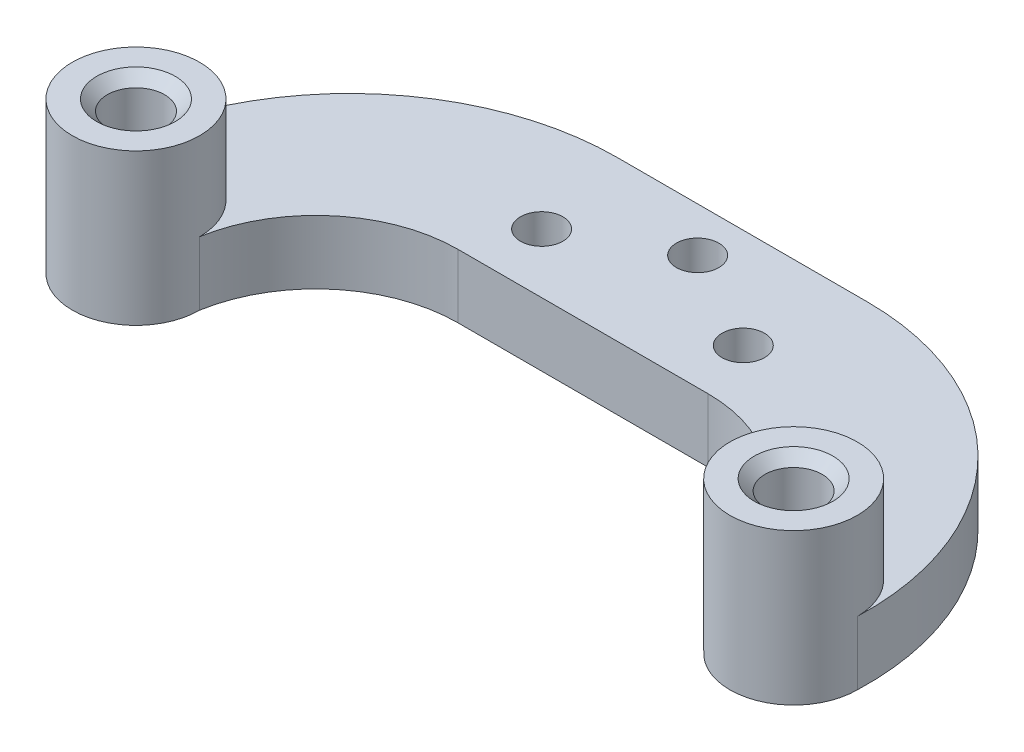
ISO-10303-21;
HEADER;
FILE_DESCRIPTION(('STEP AP214'),'2;1');
FILE_NAME('part.step','',(''),(''),'','','');
FILE_SCHEMA(('AUTOMOTIVE_DESIGN { 1 0 10303 214 1 1 1 1 }'));
ENDSEC;
DATA;
#1=APPLICATION_CONTEXT('core data for automotive mechanical design processes');
#2=APPLICATION_PROTOCOL_DEFINITION('international standard','automotive_design',2000,#1);
#3=PRODUCT_CONTEXT('',#1,'mechanical');
#4=PRODUCT('Part','Part','',(#3));
#5=PRODUCT_RELATED_PRODUCT_CATEGORY('part','',(#4));
#6=PRODUCT_DEFINITION_FORMATION('','',#4);
#7=PRODUCT_DEFINITION_CONTEXT('part definition',#1,'design');
#8=PRODUCT_DEFINITION('design','',#6,#7);
#9=PRODUCT_DEFINITION_SHAPE('','',#8);
#10=(LENGTH_UNIT() NAMED_UNIT(*) SI_UNIT(.MILLI.,.METRE.));
#11=(NAMED_UNIT(*) PLANE_ANGLE_UNIT() SI_UNIT($,.RADIAN.));
#12=(NAMED_UNIT(*) SI_UNIT($,.STERADIAN.) SOLID_ANGLE_UNIT());
#13=UNCERTAINTY_MEASURE_WITH_UNIT(LENGTH_MEASURE(1.E-05),#10,'distance_accuracy_value','');
#14=(GEOMETRIC_REPRESENTATION_CONTEXT(3) GLOBAL_UNCERTAINTY_ASSIGNED_CONTEXT((#13)) GLOBAL_UNIT_ASSIGNED_CONTEXT((#10,
#11,#12)) REPRESENTATION_CONTEXT('',''));
#15=CARTESIAN_POINT('',(0.,0.,0.));
#16=DIRECTION('',(0.,0.,1.));
#17=DIRECTION('',(1.,0.,0.));
#18=AXIS2_PLACEMENT_3D('',#15,#16,#17);
#19=CARTESIAN_POINT('',(5.88625351409411,3.,12.6147601845515));
#20=DIRECTION('',(0.,-1.,0.));
#21=DIRECTION('',(0.,0.,-1.));
#22=AXIS2_PLACEMENT_3D('',#19,#20,#21);
#23=CYLINDRICAL_SURFACE('',#22,12.6147601845515);
#24=CARTESIAN_POINT('',(5.88625351409411,0.,12.6147601845515));
#25=DIRECTION('',(0.,1.,0.));
#26=DIRECTION('',(0.,0.,1.));
#27=AXIS2_PLACEMENT_3D('',#24,#25,#26);
#28=CIRCLE('',#27,12.6147601845515);
#29=CARTESIAN_POINT('',(5.88625351409411,0.,0.));
#30=VERTEX_POINT('',#29);
#31=CARTESIAN_POINT('',(18.492796705,0.,13.07));
#32=VERTEX_POINT('',#31);
#33=EDGE_CURVE('E148',#30,#32,#28,.F.);
#34=ORIENTED_EDGE('',*,*,#33,.F.);
#35=DIRECTION('',(0.,-1.,0.));
#36=VECTOR('',#35,1.);
#37=CARTESIAN_POINT('',(5.88625351409411,3.,0.));
#38=LINE('',#37,#36);
#39=CARTESIAN_POINT('',(5.88625351409411,3.,0.));
#40=VERTEX_POINT('',#39);
#41=EDGE_CURVE('E97',#40,#30,#38,.T.);
#42=ORIENTED_EDGE('',*,*,#41,.F.);
#43=CARTESIAN_POINT('',(5.88625351409411,3.,12.6147601845515));
#44=DIRECTION('',(0.,1.,0.));
#45=DIRECTION('',(0.,0.,1.));
#46=AXIS2_PLACEMENT_3D('',#43,#44,#45);
#47=CIRCLE('',#46,12.6147601845515);
#48=CARTESIAN_POINT('',(18.492796705,3.,13.07));
#49=VERTEX_POINT('',#48);
#50=EDGE_CURVE('E181',#40,#49,#47,.F.);
#51=ORIENTED_EDGE('',*,*,#50,.T.);
#52=DIRECTION('',(0.,-1.,0.));
#53=VECTOR('',#52,1.);
#54=CARTESIAN_POINT('',(18.492796705,3.,13.07));
#55=LINE('',#54,#53);
#56=EDGE_CURVE('E92',#49,#32,#55,.T.);
#57=ORIENTED_EDGE('',*,*,#56,.T.);
#58=EDGE_LOOP('',(#34,#42,#51,#57));
#59=FACE_BOUND('',#58,.T.);
#60=ADVANCED_FACE('F38',(#59),#23,.T.);
#61=CARTESIAN_POINT('',(0.,3.,0.));
#62=DIRECTION('',(0.,0.,-1.));
#63=DIRECTION('',(-1.,0.,0.));
#64=AXIS2_PLACEMENT_3D('',#61,#62,#63);
#65=PLANE('',#64);
#66=DIRECTION('',(1.,0.,0.));
#67=VECTOR('',#66,1.);
#68=CARTESIAN_POINT('',(0.,0.,0.));
#69=LINE('',#68,#67);
#70=CARTESIAN_POINT('',(-5.88625351409411,0.,0.));
#71=VERTEX_POINT('',#70);
#72=EDGE_CURVE('E151',#71,#30,#69,.T.);
#73=ORIENTED_EDGE('',*,*,#72,.F.);
#74=DIRECTION('',(0.,-1.,0.));
#75=VECTOR('',#74,1.);
#76=CARTESIAN_POINT('',(-5.88625351409411,3.,0.));
#77=LINE('',#76,#75);
#78=CARTESIAN_POINT('',(-5.88625351409411,3.,0.));
#79=VERTEX_POINT('',#78);
#80=EDGE_CURVE('E190',#79,#71,#77,.T.);
#81=ORIENTED_EDGE('',*,*,#80,.F.);
#82=DIRECTION('',(1.,0.,0.));
#83=VECTOR('',#82,1.);
#84=CARTESIAN_POINT('',(0.,3.,0.));
#85=LINE('',#84,#83);
#86=EDGE_CURVE('E134',#79,#40,#85,.T.);
#87=ORIENTED_EDGE('',*,*,#86,.T.);
#88=ORIENTED_EDGE('',*,*,#41,.T.);
#89=EDGE_LOOP('',(#73,#81,#87,#88));
#90=FACE_BOUND('',#89,.T.);
#91=ADVANCED_FACE('F213',(#90),#65,.T.);
#92=CARTESIAN_POINT('',(-5.88625351409411,3.,12.6147601845515));
#93=DIRECTION('',(0.,-1.,0.));
#94=DIRECTION('',(0.,0.,-1.));
#95=AXIS2_PLACEMENT_3D('',#92,#93,#94);
#96=CYLINDRICAL_SURFACE('',#95,12.6147601845515);
#97=CARTESIAN_POINT('',(-5.88625351409411,0.,12.6147601845515));
#98=DIRECTION('',(0.,1.,0.));
#99=DIRECTION('',(0.,0.,1.));
#100=AXIS2_PLACEMENT_3D('',#97,#98,#99);
#101=CIRCLE('',#100,12.6147601845515);
#102=CARTESIAN_POINT('',(-18.492796705,0.,13.0700000000001));
#103=VERTEX_POINT('',#102);
#104=EDGE_CURVE('E155',#71,#103,#101,.T.);
#105=ORIENTED_EDGE('',*,*,#104,.T.);
#106=DIRECTION('',(0.,-1.,0.));
#107=VECTOR('',#106,1.);
#108=CARTESIAN_POINT('',(-18.492796705,3.,13.0700000000001));
#109=LINE('',#108,#107);
#110=CARTESIAN_POINT('',(-18.492796705,3.,13.0700000000001));
#111=VERTEX_POINT('',#110);
#112=EDGE_CURVE('E187',#111,#103,#109,.T.);
#113=ORIENTED_EDGE('',*,*,#112,.F.);
#114=CARTESIAN_POINT('',(-5.88625351409411,3.,12.6147601845515));
#115=DIRECTION('',(0.,1.,0.));
#116=DIRECTION('',(0.,0.,1.));
#117=AXIS2_PLACEMENT_3D('',#114,#115,#116);
#118=CIRCLE('',#117,12.6147601845515);
#119=EDGE_CURVE('E132',#79,#111,#118,.T.);
#120=ORIENTED_EDGE('',*,*,#119,.F.);
#121=ORIENTED_EDGE('',*,*,#80,.T.);
#122=EDGE_LOOP('',(#105,#113,#120,#121));
#123=FACE_BOUND('',#122,.T.);
#124=ADVANCED_FACE('F218',(#123),#96,.T.);
#125=CARTESIAN_POINT('',(-15.492796705,3.,13.07));
#126=DIRECTION('',(0.,-1.,0.));
#127=DIRECTION('',(0.,0.,-1.));
#128=AXIS2_PLACEMENT_3D('',#125,#126,#127);
#129=CYLINDRICAL_SURFACE('',#128,3.);
#130=CARTESIAN_POINT('',(-15.492796705,0.,13.07));
#131=DIRECTION('',(0.,1.,0.));
#132=DIRECTION('',(0.,0.,1.));
#133=AXIS2_PLACEMENT_3D('',#130,#131,#132);
#134=CIRCLE('',#133,3.);
#135=CARTESIAN_POINT('',(-12.492796705,0.,13.07));
#136=VERTEX_POINT('',#135);
#137=EDGE_CURVE('E157',#103,#136,#134,.T.);
#138=ORIENTED_EDGE('',*,*,#137,.T.);
#139=DIRECTION('',(0.,-1.,0.));
#140=VECTOR('',#139,1.);
#141=CARTESIAN_POINT('',(-12.492796705,3.,13.07));
#142=LINE('',#141,#140);
#143=CARTESIAN_POINT('',(-12.492796705,3.,13.07));
#144=VERTEX_POINT('',#143);
#145=EDGE_CURVE('E120',#144,#136,#142,.T.);
#146=ORIENTED_EDGE('',*,*,#145,.F.);
#147=CARTESIAN_POINT('',(-15.492796705,3.,13.07));
#148=DIRECTION('',(0.,1.,0.));
#149=DIRECTION('',(0.,0.,1.));
#150=AXIS2_PLACEMENT_3D('',#147,#148,#149);
#151=CIRCLE('',#150,2.99999999999999);
#152=EDGE_CURVE('E131',#144,#111,#151,.T.);
#153=ORIENTED_EDGE('',*,*,#152,.T.);
#154=ORIENTED_EDGE('',*,*,#112,.T.);
#155=EDGE_LOOP('',(#138,#146,#153,#154));
#156=FACE_BOUND('',#155,.T.);
#157=CARTESIAN_POINT('',(-15.492796705,7.12,13.07));
#158=DIRECTION('',(0.,1.,0.));
#159=DIRECTION('',(0.,0.,1.));
#160=AXIS2_PLACEMENT_3D('',#157,#158,#159);
#161=CIRCLE('',#160,2.99999999999999);
#162=CARTESIAN_POINT('',(-15.492796705,7.12,16.07));
#163=VERTEX_POINT('',#162);
#164=EDGE_CURVE('E152',#163,#163,#161,.T.);
#165=ORIENTED_EDGE('',*,*,#164,.F.);
#166=EDGE_LOOP('',(#165));
#167=FACE_BOUND('',#166,.T.);
#168=ADVANCED_FACE('F277',(#156,#167),#129,.T.);
#169=CARTESIAN_POINT('',(-5.88625351409411,3.,14.2029903889861));
#170=DIRECTION('',(0.,-1.,0.));
#171=DIRECTION('',(0.,0.,-1.));
#172=AXIS2_PLACEMENT_3D('',#169,#170,#171);
#173=CYLINDRICAL_SURFACE('',#172,6.70299038898609);
#174=CARTESIAN_POINT('',(-5.88625351409411,0.,14.2029903889861));
#175=DIRECTION('',(0.,1.,0.));
#176=DIRECTION('',(0.,0.,1.));
#177=AXIS2_PLACEMENT_3D('',#174,#175,#176);
#178=CIRCLE('',#177,6.70299038898609);
#179=CARTESIAN_POINT('',(-5.88625351409411,0.,7.5));
#180=VERTEX_POINT('',#179);
#181=EDGE_CURVE('E117',#180,#136,#178,.T.);
#182=ORIENTED_EDGE('',*,*,#181,.F.);
#183=DIRECTION('',(0.,-1.,0.));
#184=VECTOR('',#183,1.);
#185=CARTESIAN_POINT('',(-5.88625351409411,3.,7.5));
#186=LINE('',#185,#184);
#187=CARTESIAN_POINT('',(-5.88625351409411,3.,7.5));
#188=VERTEX_POINT('',#187);
#189=EDGE_CURVE('E110',#188,#180,#186,.T.);
#190=ORIENTED_EDGE('',*,*,#189,.F.);
#191=CARTESIAN_POINT('',(-5.88625351409411,3.,14.2029903889861));
#192=DIRECTION('',(0.,1.,0.));
#193=DIRECTION('',(0.,0.,1.));
#194=AXIS2_PLACEMENT_3D('',#191,#192,#193);
#195=CIRCLE('',#194,6.70299038898609);
#196=EDGE_CURVE('E114',#188,#144,#195,.T.);
#197=ORIENTED_EDGE('',*,*,#196,.T.);
#198=ORIENTED_EDGE('',*,*,#145,.T.);
#199=EDGE_LOOP('',(#182,#190,#197,#198));
#200=FACE_BOUND('',#199,.T.);
#201=ADVANCED_FACE('F112',(#200),#173,.F.);
#202=CARTESIAN_POINT('',(0.,3.,7.5));
#203=DIRECTION('',(0.,0.,-1.));
#204=DIRECTION('',(-1.,0.,0.));
#205=AXIS2_PLACEMENT_3D('',#202,#203,#204);
#206=PLANE('',#205);
#207=DIRECTION('',(1.,0.,0.));
#208=VECTOR('',#207,1.);
#209=CARTESIAN_POINT('',(0.,0.,7.5));
#210=LINE('',#209,#208);
#211=CARTESIAN_POINT('',(5.88625351409411,0.,7.5));
#212=VERTEX_POINT('',#211);
#213=EDGE_CURVE('E161',#180,#212,#210,.T.);
#214=ORIENTED_EDGE('',*,*,#213,.T.);
#215=DIRECTION('',(0.,-1.,0.));
#216=VECTOR('',#215,1.);
#217=CARTESIAN_POINT('',(5.88625351409411,3.,7.5));
#218=LINE('',#217,#216);
#219=CARTESIAN_POINT('',(5.88625351409411,3.,7.5));
#220=VERTEX_POINT('',#219);
#221=EDGE_CURVE('E121',#220,#212,#218,.T.);
#222=ORIENTED_EDGE('',*,*,#221,.F.);
#223=DIRECTION('',(1.,0.,0.));
#224=VECTOR('',#223,1.);
#225=CARTESIAN_POINT('',(0.,3.,7.5));
#226=LINE('',#225,#224);
#227=EDGE_CURVE('E124',#188,#220,#226,.T.);
#228=ORIENTED_EDGE('',*,*,#227,.F.);
#229=ORIENTED_EDGE('',*,*,#189,.T.);
#230=EDGE_LOOP('',(#214,#222,#228,#229));
#231=FACE_BOUND('',#230,.T.);
#232=ADVANCED_FACE('F125',(#231),#206,.F.);
#233=CARTESIAN_POINT('',(5.88625351409411,3.,14.2029903889861));
#234=DIRECTION('',(0.,-1.,0.));
#235=DIRECTION('',(0.,0.,-1.));
#236=AXIS2_PLACEMENT_3D('',#233,#234,#235);
#237=CYLINDRICAL_SURFACE('',#236,6.70299038898608);
#238=CARTESIAN_POINT('',(5.88625351409411,0.,14.2029903889861));
#239=DIRECTION('',(0.,1.,0.));
#240=DIRECTION('',(0.,0.,1.));
#241=AXIS2_PLACEMENT_3D('',#238,#239,#240);
#242=CIRCLE('',#241,6.70299038898608);
#243=CARTESIAN_POINT('',(12.492796705,0.,13.07));
#244=VERTEX_POINT('',#243);
#245=EDGE_CURVE('E84',#212,#244,#242,.F.);
#246=ORIENTED_EDGE('',*,*,#245,.T.);
#247=DIRECTION('',(0.,-1.,0.));
#248=VECTOR('',#247,1.);
#249=CARTESIAN_POINT('',(12.492796705,3.,13.07));
#250=LINE('',#249,#248);
#251=CARTESIAN_POINT('',(12.492796705,3.,13.07));
#252=VERTEX_POINT('',#251);
#253=EDGE_CURVE('E183',#252,#244,#250,.T.);
#254=ORIENTED_EDGE('',*,*,#253,.F.);
#255=CARTESIAN_POINT('',(5.88625351409411,3.,14.2029903889861));
#256=DIRECTION('',(0.,1.,0.));
#257=DIRECTION('',(0.,0.,1.));
#258=AXIS2_PLACEMENT_3D('',#255,#256,#257);
#259=CIRCLE('',#258,6.70299038898608);
#260=EDGE_CURVE('E55',#220,#252,#259,.F.);
#261=ORIENTED_EDGE('',*,*,#260,.F.);
#262=ORIENTED_EDGE('',*,*,#221,.T.);
#263=EDGE_LOOP('',(#246,#254,#261,#262));
#264=FACE_BOUND('',#263,.T.);
#265=ADVANCED_FACE('F255',(#264),#237,.F.);
#266=CARTESIAN_POINT('',(-4.75,3.,4.7));
#267=DIRECTION('',(0.,-1.,0.));
#268=DIRECTION('',(0.,0.,-1.));
#269=AXIS2_PLACEMENT_3D('',#266,#267,#268);
#270=CYLINDRICAL_SURFACE('',#269,1.);
#271=CARTESIAN_POINT('',(-4.75,3.,4.7));
#272=DIRECTION('',(0.,1.,0.));
#273=DIRECTION('',(0.,0.,1.));
#274=AXIS2_PLACEMENT_3D('',#271,#272,#273);
#275=CIRCLE('',#274,1.);
#276=CARTESIAN_POINT('',(-4.75,3.,5.7));
#277=VERTEX_POINT('',#276);
#278=EDGE_CURVE('E145',#277,#277,#275,.T.);
#279=ORIENTED_EDGE('',*,*,#278,.T.);
#280=EDGE_LOOP('',(#279));
#281=FACE_BOUND('',#280,.T.);
#282=CARTESIAN_POINT('',(-4.75,0.,4.7));
#283=DIRECTION('',(0.,1.,0.));
#284=DIRECTION('',(0.,0.,1.));
#285=AXIS2_PLACEMENT_3D('',#282,#283,#284);
#286=CIRCLE('',#285,1.);
#287=CARTESIAN_POINT('',(-4.75,0.,5.7));
#288=VERTEX_POINT('',#287);
#289=EDGE_CURVE('E175',#288,#288,#286,.T.);
#290=ORIENTED_EDGE('',*,*,#289,.F.);
#291=EDGE_LOOP('',(#290));
#292=FACE_BOUND('',#291,.T.);
#293=ADVANCED_FACE('F251',(#281,#292),#270,.F.);
#294=CARTESIAN_POINT('',(4.75,3.,4.7));
#295=DIRECTION('',(0.,-1.,0.));
#296=DIRECTION('',(0.,0.,-1.));
#297=AXIS2_PLACEMENT_3D('',#294,#295,#296);
#298=CYLINDRICAL_SURFACE('',#297,1.);
#299=CARTESIAN_POINT('',(4.75,3.,4.7));
#300=DIRECTION('',(0.,1.,0.));
#301=DIRECTION('',(0.,0.,1.));
#302=AXIS2_PLACEMENT_3D('',#299,#300,#301);
#303=CIRCLE('',#302,1.);
#304=CARTESIAN_POINT('',(4.75,3.,5.7));
#305=VERTEX_POINT('',#304);
#306=EDGE_CURVE('E142',#305,#305,#303,.T.);
#307=ORIENTED_EDGE('',*,*,#306,.T.);
#308=EDGE_LOOP('',(#307));
#309=FACE_BOUND('',#308,.T.);
#310=CARTESIAN_POINT('',(4.75,0.,4.7));
#311=DIRECTION('',(0.,1.,0.));
#312=DIRECTION('',(0.,0.,1.));
#313=AXIS2_PLACEMENT_3D('',#310,#311,#312);
#314=CIRCLE('',#313,1.);
#315=CARTESIAN_POINT('',(4.75,0.,5.7));
#316=VERTEX_POINT('',#315);
#317=EDGE_CURVE('E172',#316,#316,#314,.T.);
#318=ORIENTED_EDGE('',*,*,#317,.F.);
#319=EDGE_LOOP('',(#318));
#320=FACE_BOUND('',#319,.T.);
#321=ADVANCED_FACE('F254',(#309,#320),#298,.F.);
#322=CARTESIAN_POINT('',(0.,3.,2.1));
#323=DIRECTION('',(0.,-1.,0.));
#324=DIRECTION('',(0.,0.,-1.));
#325=AXIS2_PLACEMENT_3D('',#322,#323,#324);
#326=CYLINDRICAL_SURFACE('',#325,1.);
#327=CARTESIAN_POINT('',(0.,3.,2.1));
#328=DIRECTION('',(0.,1.,0.));
#329=DIRECTION('',(0.,0.,1.));
#330=AXIS2_PLACEMENT_3D('',#327,#328,#329);
#331=CIRCLE('',#330,1.);
#332=CARTESIAN_POINT('',(0.,3.,3.1));
#333=VERTEX_POINT('',#332);
#334=EDGE_CURVE('E139',#333,#333,#331,.T.);
#335=ORIENTED_EDGE('',*,*,#334,.T.);
#336=EDGE_LOOP('',(#335));
#337=FACE_BOUND('',#336,.T.);
#338=CARTESIAN_POINT('',(0.,0.,2.1));
#339=DIRECTION('',(0.,1.,0.));
#340=DIRECTION('',(0.,0.,1.));
#341=AXIS2_PLACEMENT_3D('',#338,#339,#340);
#342=CIRCLE('',#341,1.);
#343=CARTESIAN_POINT('',(0.,0.,3.1));
#344=VERTEX_POINT('',#343);
#345=EDGE_CURVE('E169',#344,#344,#342,.T.);
#346=ORIENTED_EDGE('',*,*,#345,.F.);
#347=EDGE_LOOP('',(#346));
#348=FACE_BOUND('',#347,.T.);
#349=ADVANCED_FACE('F259',(#337,#348),#326,.F.);
#350=CARTESIAN_POINT('',(15.492796705,3.,13.07));
#351=DIRECTION('',(0.,-1.,0.));
#352=DIRECTION('',(0.,0.,-1.));
#353=AXIS2_PLACEMENT_3D('',#350,#351,#352);
#354=CYLINDRICAL_SURFACE('',#353,1.35);
#355=CARTESIAN_POINT('',(15.492796705,6.62,13.07));
#356=DIRECTION('',(0.,1.,0.));
#357=DIRECTION('',(0.,0.,1.));
#358=AXIS2_PLACEMENT_3D('',#355,#356,#357);
#359=CIRCLE('',#358,1.35);
#360=CARTESIAN_POINT('',(15.492796705,6.62,14.42));
#361=VERTEX_POINT('',#360);
#362=EDGE_CURVE('E11',#361,#361,#359,.T.);
#363=ORIENTED_EDGE('',*,*,#362,.T.);
#364=EDGE_LOOP('',(#363));
#365=FACE_BOUND('',#364,.T.);
#366=CARTESIAN_POINT('',(15.492796705,0.,13.07));
#367=DIRECTION('',(0.,1.,0.));
#368=DIRECTION('',(0.,0.,1.));
#369=AXIS2_PLACEMENT_3D('',#366,#367,#368);
#370=CIRCLE('',#369,1.35);
#371=CARTESIAN_POINT('',(15.492796705,0.,14.42));
#372=VERTEX_POINT('',#371);
#373=EDGE_CURVE('E166',#372,#372,#370,.T.);
#374=ORIENTED_EDGE('',*,*,#373,.F.);
#375=EDGE_LOOP('',(#374));
#376=FACE_BOUND('',#375,.T.);
#377=ADVANCED_FACE('F263',(#365,#376),#354,.F.);
#378=CARTESIAN_POINT('',(15.492796705,3.,13.07));
#379=DIRECTION('',(0.,-1.,0.));
#380=DIRECTION('',(0.,0.,-1.));
#381=AXIS2_PLACEMENT_3D('',#378,#379,#380);
#382=CYLINDRICAL_SURFACE('',#381,3.);
#383=CARTESIAN_POINT('',(15.492796705,0.,13.07));
#384=DIRECTION('',(0.,1.,0.));
#385=DIRECTION('',(0.,0.,1.));
#386=AXIS2_PLACEMENT_3D('',#383,#384,#385);
#387=CIRCLE('',#386,3.);
#388=EDGE_CURVE('E164',#244,#32,#387,.T.);
#389=ORIENTED_EDGE('',*,*,#388,.T.);
#390=ORIENTED_EDGE('',*,*,#56,.F.);
#391=CARTESIAN_POINT('',(15.492796705,3.,13.07));
#392=DIRECTION('',(0.,-1.,0.));
#393=DIRECTION('',(0.,0.,1.));
#394=AXIS2_PLACEMENT_3D('',#391,#392,#393);
#395=CIRCLE('',#394,2.99999999999999);
#396=EDGE_CURVE('E292',#252,#49,#395,.T.);
#397=ORIENTED_EDGE('',*,*,#396,.F.);
#398=ORIENTED_EDGE('',*,*,#253,.T.);
#399=EDGE_LOOP('',(#389,#390,#397,#398));
#400=FACE_BOUND('',#399,.T.);
#401=CARTESIAN_POINT('',(15.492796705,7.12,13.07));
#402=DIRECTION('',(0.,-1.,0.));
#403=DIRECTION('',(0.,0.,1.));
#404=AXIS2_PLACEMENT_3D('',#401,#402,#403);
#405=CIRCLE('',#404,2.99999999999999);
#406=CARTESIAN_POINT('',(15.492796705,7.12,16.07));
#407=VERTEX_POINT('',#406);
#408=EDGE_CURVE('E295',#407,#407,#405,.T.);
#409=ORIENTED_EDGE('',*,*,#408,.T.);
#410=EDGE_LOOP('',(#409));
#411=FACE_BOUND('',#410,.T.);
#412=ADVANCED_FACE('F238',(#400,#411),#382,.T.);
#413=CARTESIAN_POINT('',(-15.492796705,3.,13.07));
#414=DIRECTION('',(0.,-1.,0.));
#415=DIRECTION('',(0.,0.,-1.));
#416=AXIS2_PLACEMENT_3D('',#413,#414,#415);
#417=CYLINDRICAL_SURFACE('',#416,1.35);
#418=CARTESIAN_POINT('',(-15.492796705,6.62000000000001,13.07));
#419=DIRECTION('',(0.,1.,0.));
#420=DIRECTION('',(0.,0.,1.));
#421=AXIS2_PLACEMENT_3D('',#418,#419,#420);
#422=CIRCLE('',#421,1.35);
#423=CARTESIAN_POINT('',(-15.492796705,6.62000000000001,14.42));
#424=VERTEX_POINT('',#423);
#425=EDGE_CURVE('E193',#424,#424,#422,.T.);
#426=ORIENTED_EDGE('',*,*,#425,.T.);
#427=EDGE_LOOP('',(#426));
#428=FACE_BOUND('',#427,.T.);
#429=CARTESIAN_POINT('',(-15.492796705,0.,13.07));
#430=DIRECTION('',(0.,1.,0.));
#431=DIRECTION('',(0.,0.,1.));
#432=AXIS2_PLACEMENT_3D('',#429,#430,#431);
#433=CIRCLE('',#432,1.35);
#434=CARTESIAN_POINT('',(-15.492796705,0.,14.42));
#435=VERTEX_POINT('',#434);
#436=EDGE_CURVE('E178',#435,#435,#433,.T.);
#437=ORIENTED_EDGE('',*,*,#436,.F.);
#438=EDGE_LOOP('',(#437));
#439=FACE_BOUND('',#438,.T.);
#440=ADVANCED_FACE('F235',(#428,#439),#417,.F.);
#441=CARTESIAN_POINT('',(0.,3.,0.));
#442=DIRECTION('',(0.,1.,0.));
#443=DIRECTION('',(0.,0.,1.));
#444=AXIS2_PLACEMENT_3D('',#441,#442,#443);
#445=PLANE('',#444);
#446=ORIENTED_EDGE('',*,*,#396,.T.);
#447=ORIENTED_EDGE('',*,*,#50,.F.);
#448=ORIENTED_EDGE('',*,*,#86,.F.);
#449=ORIENTED_EDGE('',*,*,#119,.T.);
#450=ORIENTED_EDGE('',*,*,#152,.F.);
#451=ORIENTED_EDGE('',*,*,#196,.F.);
#452=ORIENTED_EDGE('',*,*,#227,.T.);
#453=ORIENTED_EDGE('',*,*,#260,.T.);
#454=EDGE_LOOP('',(#446,#447,#448,#449,#450,#451,#452,#453));
#455=FACE_BOUND('',#454,.T.);
#456=ORIENTED_EDGE('',*,*,#334,.F.);
#457=EDGE_LOOP('',(#456));
#458=FACE_BOUND('',#457,.T.);
#459=ORIENTED_EDGE('',*,*,#306,.F.);
#460=EDGE_LOOP('',(#459));
#461=FACE_BOUND('',#460,.T.);
#462=ORIENTED_EDGE('',*,*,#278,.F.);
#463=EDGE_LOOP('',(#462));
#464=FACE_BOUND('',#463,.T.);
#465=ADVANCED_FACE('F128',(#455,#458,#461,#464),#445,.T.);
#466=CARTESIAN_POINT('',(0.,0.,0.));
#467=DIRECTION('',(0.,1.,0.));
#468=DIRECTION('',(0.,0.,1.));
#469=AXIS2_PLACEMENT_3D('',#466,#467,#468);
#470=PLANE('',#469);
#471=ORIENTED_EDGE('',*,*,#33,.T.);
#472=ORIENTED_EDGE('',*,*,#388,.F.);
#473=ORIENTED_EDGE('',*,*,#245,.F.);
#474=ORIENTED_EDGE('',*,*,#213,.F.);
#475=ORIENTED_EDGE('',*,*,#181,.T.);
#476=ORIENTED_EDGE('',*,*,#137,.F.);
#477=ORIENTED_EDGE('',*,*,#104,.F.);
#478=ORIENTED_EDGE('',*,*,#72,.T.);
#479=EDGE_LOOP('',(#471,#472,#473,#474,#475,#476,#477,#478));
#480=FACE_BOUND('',#479,.T.);
#481=ORIENTED_EDGE('',*,*,#373,.T.);
#482=EDGE_LOOP('',(#481));
#483=FACE_BOUND('',#482,.T.);
#484=ORIENTED_EDGE('',*,*,#345,.T.);
#485=EDGE_LOOP('',(#484));
#486=FACE_BOUND('',#485,.T.);
#487=ORIENTED_EDGE('',*,*,#317,.T.);
#488=EDGE_LOOP('',(#487));
#489=FACE_BOUND('',#488,.T.);
#490=ORIENTED_EDGE('',*,*,#289,.T.);
#491=EDGE_LOOP('',(#490));
#492=FACE_BOUND('',#491,.T.);
#493=ORIENTED_EDGE('',*,*,#436,.T.);
#494=EDGE_LOOP('',(#493));
#495=FACE_BOUND('',#494,.T.);
#496=ADVANCED_FACE('F228',(#480,#483,#486,#489,#492,#495),#470,.F.);
#497=CARTESIAN_POINT('',(0.,7.12,13.07));
#498=DIRECTION('',(0.,1.,0.));
#499=DIRECTION('',(0.,0.,1.));
#500=AXIS2_PLACEMENT_3D('',#497,#498,#499);
#501=PLANE('',#500);
#502=CARTESIAN_POINT('',(-15.492796705,7.12,13.07));
#503=DIRECTION('',(0.,1.,0.));
#504=DIRECTION('',(0.,0.,1.));
#505=AXIS2_PLACEMENT_3D('',#502,#503,#504);
#506=CIRCLE('',#505,1.84999999999999);
#507=CARTESIAN_POINT('',(-15.492796705,7.12,14.92));
#508=VERTEX_POINT('',#507);
#509=EDGE_CURVE('E196',#508,#508,#506,.F.);
#510=ORIENTED_EDGE('',*,*,#509,.T.);
#511=EDGE_LOOP('',(#510));
#512=FACE_BOUND('',#511,.T.);
#513=ORIENTED_EDGE('',*,*,#164,.T.);
#514=EDGE_LOOP('',(#513));
#515=FACE_BOUND('',#514,.T.);
#516=ADVANCED_FACE('F223',(#512,#515),#501,.T.);
#517=CARTESIAN_POINT('',(-15.492796705,6.62000000000001,13.07));
#518=DIRECTION('',(0.,1.,0.));
#519=DIRECTION('',(0.,0.,1.));
#520=AXIS2_PLACEMENT_3D('',#517,#518,#519);
#521=CONICAL_SURFACE('',#520,1.35,0.785398163397447);
#522=ORIENTED_EDGE('',*,*,#509,.F.);
#523=EDGE_LOOP('',(#522));
#524=FACE_BOUND('',#523,.T.);
#525=ORIENTED_EDGE('',*,*,#425,.F.);
#526=EDGE_LOOP('',(#525));
#527=FACE_BOUND('',#526,.T.);
#528=ADVANCED_FACE('F209',(#524,#527),#521,.F.);
#529=CARTESIAN_POINT('',(0.,7.12,13.07));
#530=DIRECTION('',(0.,1.,0.));
#531=DIRECTION('',(0.,0.,1.));
#532=AXIS2_PLACEMENT_3D('',#529,#530,#531);
#533=PLANE('',#532);
#534=CARTESIAN_POINT('',(15.492796705,7.12,13.07));
#535=DIRECTION('',(0.,1.,0.));
#536=DIRECTION('',(0.,0.,1.));
#537=AXIS2_PLACEMENT_3D('',#534,#535,#536);
#538=CIRCLE('',#537,1.85000000000001);
#539=CARTESIAN_POINT('',(15.492796705,7.12,14.92));
#540=VERTEX_POINT('',#539);
#541=EDGE_CURVE('E47',#540,#540,#538,.F.);
#542=ORIENTED_EDGE('',*,*,#541,.T.);
#543=EDGE_LOOP('',(#542));
#544=FACE_BOUND('',#543,.T.);
#545=ORIENTED_EDGE('',*,*,#408,.F.);
#546=EDGE_LOOP('',(#545));
#547=FACE_BOUND('',#546,.T.);
#548=ADVANCED_FACE('F201',(#544,#547),#533,.T.);
#549=CARTESIAN_POINT('',(15.492796705,7.12,13.07));
#550=DIRECTION('',(0.,1.,0.));
#551=DIRECTION('',(0.,0.,1.));
#552=AXIS2_PLACEMENT_3D('',#549,#550,#551);
#553=CONICAL_SURFACE('',#552,1.85000000000001,0.785398163397453);
#554=ORIENTED_EDGE('',*,*,#362,.F.);
#555=EDGE_LOOP('',(#554));
#556=FACE_BOUND('',#555,.T.);
#557=ORIENTED_EDGE('',*,*,#541,.F.);
#558=EDGE_LOOP('',(#557));
#559=FACE_BOUND('',#558,.T.);
#560=ADVANCED_FACE('F40',(#556,#559),#553,.F.);
#561=CLOSED_SHELL('',(#60,#91,#124,#168,#201,#232,#265,#293,#321,#349,#377,#412,#440,#465,#496,
#516,#528,#548,#560));
#562=MANIFOLD_SOLID_BREP('B2',#561);
#563=ADVANCED_BREP_SHAPE_REPRESENTATION('',(#18,#562),#14);
#564=SHAPE_DEFINITION_REPRESENTATION(#9,#563);
ENDSEC;
END-ISO-10303-21;
